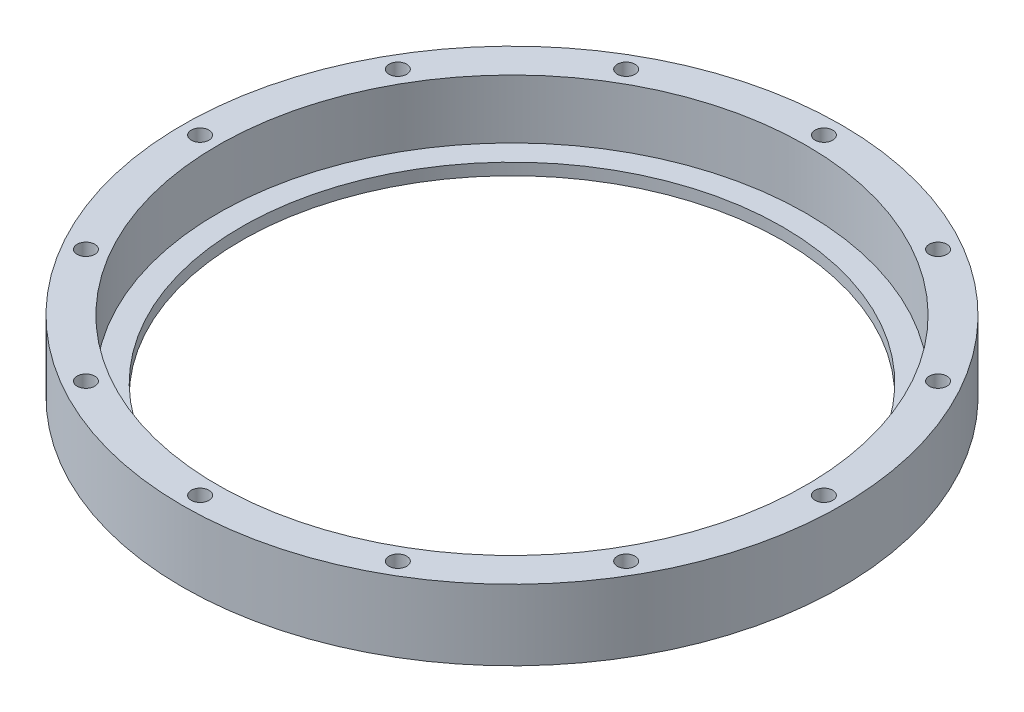
ISO-10303-21;
HEADER;
FILE_DESCRIPTION(('STEP AP214'),'2;1');
FILE_NAME('part.step','',(''),(''),'','','');
FILE_SCHEMA(('AUTOMOTIVE_DESIGN { 1 0 10303 214 1 1 1 1 }'));
ENDSEC;
DATA;
#1=APPLICATION_CONTEXT('core data for automotive mechanical design processes');
#2=APPLICATION_PROTOCOL_DEFINITION('international standard','automotive_design',2000,#1);
#3=PRODUCT_CONTEXT('',#1,'mechanical');
#4=PRODUCT('Part','Part','',(#3));
#5=PRODUCT_RELATED_PRODUCT_CATEGORY('part','',(#4));
#6=PRODUCT_DEFINITION_FORMATION('','',#4);
#7=PRODUCT_DEFINITION_CONTEXT('part definition',#1,'design');
#8=PRODUCT_DEFINITION('design','',#6,#7);
#9=PRODUCT_DEFINITION_SHAPE('','',#8);
#10=(LENGTH_UNIT() NAMED_UNIT(*) SI_UNIT(.MILLI.,.METRE.));
#11=(NAMED_UNIT(*) PLANE_ANGLE_UNIT() SI_UNIT($,.RADIAN.));
#12=(NAMED_UNIT(*) SI_UNIT($,.STERADIAN.) SOLID_ANGLE_UNIT());
#13=UNCERTAINTY_MEASURE_WITH_UNIT(LENGTH_MEASURE(1.E-05),#10,'distance_accuracy_value','');
#14=(GEOMETRIC_REPRESENTATION_CONTEXT(3) GLOBAL_UNCERTAINTY_ASSIGNED_CONTEXT((#13)) GLOBAL_UNIT_ASSIGNED_CONTEXT((#10,
#11,#12)) REPRESENTATION_CONTEXT('',''));
#15=CARTESIAN_POINT('',(0.,0.,0.));
#16=DIRECTION('',(0.,0.,1.));
#17=DIRECTION('',(1.,0.,0.));
#18=AXIS2_PLACEMENT_3D('',#15,#16,#17);
#19=CARTESIAN_POINT('',(56.,0.,0.));
#20=DIRECTION('',(0.,-1.,0.));
#21=DIRECTION('',(0.,0.,-1.));
#22=AXIS2_PLACEMENT_3D('',#19,#20,#21);
#23=PLANE('',#22);
#24=CARTESIAN_POINT('',(0.,0.,-53.));
#25=DIRECTION('',(0.,1.,0.));
#26=DIRECTION('',(0.,0.,1.));
#27=AXIS2_PLACEMENT_3D('',#24,#25,#26);
#28=CIRCLE('',#27,1.5);
#29=CARTESIAN_POINT('',(0.,0.,-51.5));
#30=VERTEX_POINT('',#29);
#31=EDGE_CURVE('E89',#30,#30,#28,.T.);
#32=ORIENTED_EDGE('',*,*,#31,.T.);
#33=EDGE_LOOP('',(#32));
#34=FACE_BOUND('',#33,.T.);
#35=CARTESIAN_POINT('',(-26.5,0.,-45.8993464005752));
#36=DIRECTION('',(0.,1.,0.));
#37=DIRECTION('',(0.,0.,1.));
#38=AXIS2_PLACEMENT_3D('',#35,#36,#37);
#39=CIRCLE('',#38,1.5);
#40=CARTESIAN_POINT('',(-26.5,0.,-44.3993464005752));
#41=VERTEX_POINT('',#40);
#42=EDGE_CURVE('E113',#41,#41,#39,.T.);
#43=ORIENTED_EDGE('',*,*,#42,.T.);
#44=EDGE_LOOP('',(#43));
#45=FACE_BOUND('',#44,.T.);
#46=CARTESIAN_POINT('',(-45.8993464005753,0.,-26.5));
#47=DIRECTION('',(0.,1.,0.));
#48=DIRECTION('',(0.,0.,1.));
#49=AXIS2_PLACEMENT_3D('',#46,#47,#48);
#50=CIRCLE('',#49,1.5);
#51=CARTESIAN_POINT('',(-45.8993464005753,0.,-25.));
#52=VERTEX_POINT('',#51);
#53=EDGE_CURVE('E123',#52,#52,#50,.T.);
#54=ORIENTED_EDGE('',*,*,#53,.T.);
#55=EDGE_LOOP('',(#54));
#56=FACE_BOUND('',#55,.T.);
#57=CARTESIAN_POINT('',(-53.,0.,0.));
#58=DIRECTION('',(0.,1.,0.));
#59=DIRECTION('',(0.,0.,1.));
#60=AXIS2_PLACEMENT_3D('',#57,#58,#59);
#61=CIRCLE('',#60,1.5);
#62=CARTESIAN_POINT('',(-53.,0.,1.50000000000001));
#63=VERTEX_POINT('',#62);
#64=EDGE_CURVE('E130',#63,#63,#61,.T.);
#65=ORIENTED_EDGE('',*,*,#64,.T.);
#66=EDGE_LOOP('',(#65));
#67=FACE_BOUND('',#66,.T.);
#68=CARTESIAN_POINT('',(26.5,0.,-45.8993464005752));
#69=DIRECTION('',(0.,1.,0.));
#70=DIRECTION('',(0.,0.,1.));
#71=AXIS2_PLACEMENT_3D('',#68,#69,#70);
#72=CIRCLE('',#71,1.5);
#73=CARTESIAN_POINT('',(26.5,0.,-44.3993464005752));
#74=VERTEX_POINT('',#73);
#75=EDGE_CURVE('E82',#74,#74,#72,.T.);
#76=ORIENTED_EDGE('',*,*,#75,.T.);
#77=EDGE_LOOP('',(#76));
#78=FACE_BOUND('',#77,.T.);
#79=CARTESIAN_POINT('',(45.8993464005752,0.,-26.5));
#80=DIRECTION('',(0.,1.,0.));
#81=DIRECTION('',(0.,0.,1.));
#82=AXIS2_PLACEMENT_3D('',#79,#80,#81);
#83=CIRCLE('',#82,1.5);
#84=CARTESIAN_POINT('',(45.8993464005752,0.,-25.));
#85=VERTEX_POINT('',#84);
#86=EDGE_CURVE('E76',#85,#85,#83,.T.);
#87=ORIENTED_EDGE('',*,*,#86,.T.);
#88=EDGE_LOOP('',(#87));
#89=FACE_BOUND('',#88,.T.);
#90=CARTESIAN_POINT('',(53.,0.,0.));
#91=DIRECTION('',(0.,1.,0.));
#92=DIRECTION('',(0.,0.,1.));
#93=AXIS2_PLACEMENT_3D('',#90,#91,#92);
#94=CIRCLE('',#93,1.5);
#95=CARTESIAN_POINT('',(53.,0.,1.5));
#96=VERTEX_POINT('',#95);
#97=EDGE_CURVE('E75',#96,#96,#94,.T.);
#98=ORIENTED_EDGE('',*,*,#97,.T.);
#99=EDGE_LOOP('',(#98));
#100=FACE_BOUND('',#99,.T.);
#101=CARTESIAN_POINT('',(45.8993464005753,0.,26.5));
#102=DIRECTION('',(0.,1.,0.));
#103=DIRECTION('',(0.,0.,1.));
#104=AXIS2_PLACEMENT_3D('',#101,#102,#103);
#105=CIRCLE('',#104,1.5);
#106=CARTESIAN_POINT('',(45.8993464005753,0.,28.));
#107=VERTEX_POINT('',#106);
#108=EDGE_CURVE('E62',#107,#107,#105,.T.);
#109=ORIENTED_EDGE('',*,*,#108,.T.);
#110=EDGE_LOOP('',(#109));
#111=FACE_BOUND('',#110,.T.);
#112=CARTESIAN_POINT('',(26.5,0.,45.8993464005752));
#113=DIRECTION('',(0.,1.,0.));
#114=DIRECTION('',(0.,0.,1.));
#115=AXIS2_PLACEMENT_3D('',#112,#113,#114);
#116=CIRCLE('',#115,1.5);
#117=CARTESIAN_POINT('',(26.5,0.,47.3993464005752));
#118=VERTEX_POINT('',#117);
#119=EDGE_CURVE('E109',#118,#118,#116,.T.);
#120=ORIENTED_EDGE('',*,*,#119,.T.);
#121=EDGE_LOOP('',(#120));
#122=FACE_BOUND('',#121,.T.);
#123=CARTESIAN_POINT('',(0.,0.,53.));
#124=DIRECTION('',(0.,1.,0.));
#125=DIRECTION('',(0.,0.,1.));
#126=AXIS2_PLACEMENT_3D('',#123,#124,#125);
#127=CIRCLE('',#126,1.5);
#128=CARTESIAN_POINT('',(0.,0.,54.5));
#129=VERTEX_POINT('',#128);
#130=EDGE_CURVE('E102',#129,#129,#127,.T.);
#131=ORIENTED_EDGE('',*,*,#130,.T.);
#132=EDGE_LOOP('',(#131));
#133=FACE_BOUND('',#132,.T.);
#134=CARTESIAN_POINT('',(-26.5,0.,45.8993464005753));
#135=DIRECTION('',(0.,1.,0.));
#136=DIRECTION('',(0.,0.,1.));
#137=AXIS2_PLACEMENT_3D('',#134,#135,#136);
#138=CIRCLE('',#137,1.5);
#139=CARTESIAN_POINT('',(-26.5,0.,47.3993464005753));
#140=VERTEX_POINT('',#139);
#141=EDGE_CURVE('E98',#140,#140,#138,.T.);
#142=ORIENTED_EDGE('',*,*,#141,.T.);
#143=EDGE_LOOP('',(#142));
#144=FACE_BOUND('',#143,.T.);
#145=CARTESIAN_POINT('',(-45.8993464005752,0.,26.5));
#146=DIRECTION('',(0.,1.,0.));
#147=DIRECTION('',(0.,0.,1.));
#148=AXIS2_PLACEMENT_3D('',#145,#146,#147);
#149=CIRCLE('',#148,1.5);
#150=CARTESIAN_POINT('',(-45.8993464005752,0.,28.));
#151=VERTEX_POINT('',#150);
#152=EDGE_CURVE('E93',#151,#151,#149,.T.);
#153=ORIENTED_EDGE('',*,*,#152,.T.);
#154=EDGE_LOOP('',(#153));
#155=FACE_BOUND('',#154,.T.);
#156=CARTESIAN_POINT('',(0.,0.,0.));
#157=DIRECTION('',(0.,-1.,0.));
#158=DIRECTION('',(0.,0.,-1.));
#159=AXIS2_PLACEMENT_3D('',#156,#157,#158);
#160=CIRCLE('',#159,56.);
#161=CARTESIAN_POINT('',(0.,0.,-56.));
#162=VERTEX_POINT('',#161);
#163=EDGE_CURVE('E63',#162,#162,#160,.T.);
#164=ORIENTED_EDGE('',*,*,#163,.T.);
#165=EDGE_LOOP('',(#164));
#166=FACE_BOUND('',#165,.T.);
#167=CARTESIAN_POINT('',(0.,0.,0.));
#168=DIRECTION('',(0.,-1.,0.));
#169=DIRECTION('',(0.,0.,-1.));
#170=AXIS2_PLACEMENT_3D('',#167,#168,#169);
#171=CIRCLE('',#170,46.);
#172=CARTESIAN_POINT('',(0.,0.,-46.));
#173=VERTEX_POINT('',#172);
#174=EDGE_CURVE('E10',#173,#173,#171,.T.);
#175=ORIENTED_EDGE('',*,*,#174,.F.);
#176=EDGE_LOOP('',(#175));
#177=FACE_BOUND('',#176,.T.);
#178=ADVANCED_FACE('F39',(#34,#45,#56,#67,#78,#89,#100,#111,#122,#133,#144,#155,#166,#177),#23,.T.);
#179=CARTESIAN_POINT('',(0.,0.,0.));
#180=DIRECTION('',(0.,-1.,0.));
#181=DIRECTION('',(0.,0.,-1.));
#182=AXIS2_PLACEMENT_3D('',#179,#180,#181);
#183=CYLINDRICAL_SURFACE('',#182,46.);
#184=ORIENTED_EDGE('',*,*,#174,.T.);
#185=EDGE_LOOP('',(#184));
#186=FACE_BOUND('',#185,.T.);
#187=CARTESIAN_POINT('',(0.,2.,0.));
#188=DIRECTION('',(0.,-1.,0.));
#189=DIRECTION('',(0.,0.,-1.));
#190=AXIS2_PLACEMENT_3D('',#187,#188,#189);
#191=CIRCLE('',#190,46.);
#192=CARTESIAN_POINT('',(0.,2.,-46.));
#193=VERTEX_POINT('',#192);
#194=EDGE_CURVE('E44',#193,#193,#191,.T.);
#195=ORIENTED_EDGE('',*,*,#194,.F.);
#196=EDGE_LOOP('',(#195));
#197=FACE_BOUND('',#196,.T.);
#198=ADVANCED_FACE('F179',(#186,#197),#183,.F.);
#199=CARTESIAN_POINT('',(46.,2.,0.));
#200=DIRECTION('',(0.,1.,0.));
#201=DIRECTION('',(0.,0.,1.));
#202=AXIS2_PLACEMENT_3D('',#199,#200,#201);
#203=PLANE('',#202);
#204=ORIENTED_EDGE('',*,*,#194,.T.);
#205=EDGE_LOOP('',(#204));
#206=FACE_BOUND('',#205,.T.);
#207=CARTESIAN_POINT('',(0.,2.,0.));
#208=DIRECTION('',(0.,-1.,0.));
#209=DIRECTION('',(0.,0.,-1.));
#210=AXIS2_PLACEMENT_3D('',#207,#208,#209);
#211=CIRCLE('',#210,50.);
#212=CARTESIAN_POINT('',(0.,2.,-50.));
#213=VERTEX_POINT('',#212);
#214=EDGE_CURVE('E47',#213,#213,#211,.T.);
#215=ORIENTED_EDGE('',*,*,#214,.F.);
#216=EDGE_LOOP('',(#215));
#217=FACE_BOUND('',#216,.T.);
#218=ADVANCED_FACE('F183',(#206,#217),#203,.T.);
#219=CARTESIAN_POINT('',(0.,0.,0.));
#220=DIRECTION('',(0.,-1.,0.));
#221=DIRECTION('',(0.,0.,-1.));
#222=AXIS2_PLACEMENT_3D('',#219,#220,#221);
#223=CYLINDRICAL_SURFACE('',#222,50.);
#224=ORIENTED_EDGE('',*,*,#214,.T.);
#225=EDGE_LOOP('',(#224));
#226=FACE_BOUND('',#225,.T.);
#227=CARTESIAN_POINT('',(0.,12.,0.));
#228=DIRECTION('',(0.,-1.,0.));
#229=DIRECTION('',(0.,0.,-1.));
#230=AXIS2_PLACEMENT_3D('',#227,#228,#229);
#231=CIRCLE('',#230,50.);
#232=CARTESIAN_POINT('',(0.,12.,-50.));
#233=VERTEX_POINT('',#232);
#234=EDGE_CURVE('E52',#233,#233,#231,.T.);
#235=ORIENTED_EDGE('',*,*,#234,.F.);
#236=EDGE_LOOP('',(#235));
#237=FACE_BOUND('',#236,.T.);
#238=ADVANCED_FACE('F145',(#226,#237),#223,.F.);
#239=CARTESIAN_POINT('',(50.,12.,0.));
#240=DIRECTION('',(0.,1.,0.));
#241=DIRECTION('',(0.,0.,1.));
#242=AXIS2_PLACEMENT_3D('',#239,#240,#241);
#243=PLANE('',#242);
#244=CARTESIAN_POINT('',(0.,12.,-53.));
#245=DIRECTION('',(0.,1.,0.));
#246=DIRECTION('',(0.,0.,1.));
#247=AXIS2_PLACEMENT_3D('',#244,#245,#246);
#248=CIRCLE('',#247,1.5);
#249=CARTESIAN_POINT('',(0.,12.,-51.5));
#250=VERTEX_POINT('',#249);
#251=EDGE_CURVE('E64',#250,#250,#248,.T.);
#252=ORIENTED_EDGE('',*,*,#251,.F.);
#253=EDGE_LOOP('',(#252));
#254=FACE_BOUND('',#253,.T.);
#255=CARTESIAN_POINT('',(-26.5,12.,-45.8993464005752));
#256=DIRECTION('',(0.,1.,0.));
#257=DIRECTION('',(0.,0.,1.));
#258=AXIS2_PLACEMENT_3D('',#255,#256,#257);
#259=CIRCLE('',#258,1.5);
#260=CARTESIAN_POINT('',(-26.5,12.,-44.3993464005752));
#261=VERTEX_POINT('',#260);
#262=EDGE_CURVE('E116',#261,#261,#259,.T.);
#263=ORIENTED_EDGE('',*,*,#262,.F.);
#264=EDGE_LOOP('',(#263));
#265=FACE_BOUND('',#264,.T.);
#266=CARTESIAN_POINT('',(-45.8993464005753,12.,-26.5));
#267=DIRECTION('',(0.,1.,0.));
#268=DIRECTION('',(0.,0.,1.));
#269=AXIS2_PLACEMENT_3D('',#266,#267,#268);
#270=CIRCLE('',#269,1.5);
#271=CARTESIAN_POINT('',(-45.8993464005753,12.,-25.));
#272=VERTEX_POINT('',#271);
#273=EDGE_CURVE('E122',#272,#272,#270,.T.);
#274=ORIENTED_EDGE('',*,*,#273,.F.);
#275=EDGE_LOOP('',(#274));
#276=FACE_BOUND('',#275,.T.);
#277=CARTESIAN_POINT('',(-53.,12.,0.));
#278=DIRECTION('',(0.,1.,0.));
#279=DIRECTION('',(0.,0.,1.));
#280=AXIS2_PLACEMENT_3D('',#277,#278,#279);
#281=CIRCLE('',#280,1.5);
#282=CARTESIAN_POINT('',(-53.,12.,1.50000000000001));
#283=VERTEX_POINT('',#282);
#284=EDGE_CURVE('E92',#283,#283,#281,.T.);
#285=ORIENTED_EDGE('',*,*,#284,.F.);
#286=EDGE_LOOP('',(#285));
#287=FACE_BOUND('',#286,.T.);
#288=CARTESIAN_POINT('',(26.5,12.,-45.8993464005752));
#289=DIRECTION('',(0.,1.,0.));
#290=DIRECTION('',(0.,0.,1.));
#291=AXIS2_PLACEMENT_3D('',#288,#289,#290);
#292=CIRCLE('',#291,1.5);
#293=CARTESIAN_POINT('',(26.5,12.,-44.3993464005752));
#294=VERTEX_POINT('',#293);
#295=EDGE_CURVE('E87',#294,#294,#292,.T.);
#296=ORIENTED_EDGE('',*,*,#295,.F.);
#297=EDGE_LOOP('',(#296));
#298=FACE_BOUND('',#297,.T.);
#299=CARTESIAN_POINT('',(45.8993464005752,12.,-26.5));
#300=DIRECTION('',(0.,1.,0.));
#301=DIRECTION('',(0.,0.,1.));
#302=AXIS2_PLACEMENT_3D('',#299,#300,#301);
#303=CIRCLE('',#302,1.5);
#304=CARTESIAN_POINT('',(45.8993464005752,12.,-25.));
#305=VERTEX_POINT('',#304);
#306=EDGE_CURVE('E83',#305,#305,#303,.T.);
#307=ORIENTED_EDGE('',*,*,#306,.F.);
#308=EDGE_LOOP('',(#307));
#309=FACE_BOUND('',#308,.T.);
#310=CARTESIAN_POINT('',(53.,12.,0.));
#311=DIRECTION('',(0.,1.,0.));
#312=DIRECTION('',(0.,0.,1.));
#313=AXIS2_PLACEMENT_3D('',#310,#311,#312);
#314=CIRCLE('',#313,1.5);
#315=CARTESIAN_POINT('',(53.,12.,1.5));
#316=VERTEX_POINT('',#315);
#317=EDGE_CURVE('E73',#316,#316,#314,.T.);
#318=ORIENTED_EDGE('',*,*,#317,.F.);
#319=EDGE_LOOP('',(#318));
#320=FACE_BOUND('',#319,.T.);
#321=CARTESIAN_POINT('',(45.8993464005753,12.,26.5));
#322=DIRECTION('',(0.,1.,0.));
#323=DIRECTION('',(0.,0.,1.));
#324=AXIS2_PLACEMENT_3D('',#321,#322,#323);
#325=CIRCLE('',#324,1.5);
#326=CARTESIAN_POINT('',(45.8993464005753,12.,28.));
#327=VERTEX_POINT('',#326);
#328=EDGE_CURVE('E66',#327,#327,#325,.T.);
#329=ORIENTED_EDGE('',*,*,#328,.F.);
#330=EDGE_LOOP('',(#329));
#331=FACE_BOUND('',#330,.T.);
#332=CARTESIAN_POINT('',(26.5,12.,45.8993464005752));
#333=DIRECTION('',(0.,1.,0.));
#334=DIRECTION('',(0.,0.,1.));
#335=AXIS2_PLACEMENT_3D('',#332,#333,#334);
#336=CIRCLE('',#335,1.5);
#337=CARTESIAN_POINT('',(26.5,12.,47.3993464005752));
#338=VERTEX_POINT('',#337);
#339=EDGE_CURVE('E67',#338,#338,#336,.T.);
#340=ORIENTED_EDGE('',*,*,#339,.F.);
#341=EDGE_LOOP('',(#340));
#342=FACE_BOUND('',#341,.T.);
#343=CARTESIAN_POINT('',(0.,12.,53.));
#344=DIRECTION('',(0.,1.,0.));
#345=DIRECTION('',(0.,0.,1.));
#346=AXIS2_PLACEMENT_3D('',#343,#344,#345);
#347=CIRCLE('',#346,1.5);
#348=CARTESIAN_POINT('',(0.,12.,54.5));
#349=VERTEX_POINT('',#348);
#350=EDGE_CURVE('E110',#349,#349,#347,.T.);
#351=ORIENTED_EDGE('',*,*,#350,.F.);
#352=EDGE_LOOP('',(#351));
#353=FACE_BOUND('',#352,.T.);
#354=CARTESIAN_POINT('',(-26.5,12.,45.8993464005753));
#355=DIRECTION('',(0.,1.,0.));
#356=DIRECTION('',(0.,0.,1.));
#357=AXIS2_PLACEMENT_3D('',#354,#355,#356);
#358=CIRCLE('',#357,1.5);
#359=CARTESIAN_POINT('',(-26.5,12.,47.3993464005753));
#360=VERTEX_POINT('',#359);
#361=EDGE_CURVE('E101',#360,#360,#358,.T.);
#362=ORIENTED_EDGE('',*,*,#361,.F.);
#363=EDGE_LOOP('',(#362));
#364=FACE_BOUND('',#363,.T.);
#365=CARTESIAN_POINT('',(-45.8993464005752,12.,26.5));
#366=DIRECTION('',(0.,1.,0.));
#367=DIRECTION('',(0.,0.,1.));
#368=AXIS2_PLACEMENT_3D('',#365,#366,#367);
#369=CIRCLE('',#368,1.5);
#370=CARTESIAN_POINT('',(-45.8993464005752,12.,28.));
#371=VERTEX_POINT('',#370);
#372=EDGE_CURVE('E94',#371,#371,#369,.T.);
#373=ORIENTED_EDGE('',*,*,#372,.F.);
#374=EDGE_LOOP('',(#373));
#375=FACE_BOUND('',#374,.T.);
#376=ORIENTED_EDGE('',*,*,#234,.T.);
#377=EDGE_LOOP('',(#376));
#378=FACE_BOUND('',#377,.T.);
#379=CARTESIAN_POINT('',(0.,12.,0.));
#380=DIRECTION('',(0.,-1.,0.));
#381=DIRECTION('',(0.,0.,-1.));
#382=AXIS2_PLACEMENT_3D('',#379,#380,#381);
#383=CIRCLE('',#382,56.);
#384=CARTESIAN_POINT('',(0.,12.,-56.));
#385=VERTEX_POINT('',#384);
#386=EDGE_CURVE('E59',#385,#385,#383,.T.);
#387=ORIENTED_EDGE('',*,*,#386,.F.);
#388=EDGE_LOOP('',(#387));
#389=FACE_BOUND('',#388,.T.);
#390=ADVANCED_FACE('F139',(#254,#265,#276,#287,#298,#309,#320,#331,#342,#353,#364,#375,#378,
#389),#243,.T.);
#391=CARTESIAN_POINT('',(0.,0.,0.));
#392=DIRECTION('',(0.,-1.,0.));
#393=DIRECTION('',(0.,0.,-1.));
#394=AXIS2_PLACEMENT_3D('',#391,#392,#393);
#395=CYLINDRICAL_SURFACE('',#394,56.);
#396=ORIENTED_EDGE('',*,*,#386,.T.);
#397=EDGE_LOOP('',(#396));
#398=FACE_BOUND('',#397,.T.);
#399=ORIENTED_EDGE('',*,*,#163,.F.);
#400=EDGE_LOOP('',(#399));
#401=FACE_BOUND('',#400,.T.);
#402=ADVANCED_FACE('F141',(#398,#401),#395,.T.);
#403=CARTESIAN_POINT('',(-45.8993464005752,12.,26.5));
#404=DIRECTION('',(0.,-1.,0.));
#405=DIRECTION('',(0.,0.,-1.));
#406=AXIS2_PLACEMENT_3D('',#403,#404,#405);
#407=CYLINDRICAL_SURFACE('',#406,1.5);
#408=ORIENTED_EDGE('',*,*,#372,.T.);
#409=EDGE_LOOP('',(#408));
#410=FACE_BOUND('',#409,.T.);
#411=ORIENTED_EDGE('',*,*,#152,.F.);
#412=EDGE_LOOP('',(#411));
#413=FACE_BOUND('',#412,.T.);
#414=ADVANCED_FACE('F174',(#410,#413),#407,.F.);
#415=CARTESIAN_POINT('',(-26.5,12.,45.8993464005753));
#416=DIRECTION('',(0.,-1.,0.));
#417=DIRECTION('',(0.,0.,-1.));
#418=AXIS2_PLACEMENT_3D('',#415,#416,#417);
#419=CYLINDRICAL_SURFACE('',#418,1.5);
#420=ORIENTED_EDGE('',*,*,#361,.T.);
#421=EDGE_LOOP('',(#420));
#422=FACE_BOUND('',#421,.T.);
#423=ORIENTED_EDGE('',*,*,#141,.F.);
#424=EDGE_LOOP('',(#423));
#425=FACE_BOUND('',#424,.T.);
#426=ADVANCED_FACE('F211',(#422,#425),#419,.F.);
#427=CARTESIAN_POINT('',(0.,12.,53.));
#428=DIRECTION('',(0.,-1.,0.));
#429=DIRECTION('',(0.,0.,-1.));
#430=AXIS2_PLACEMENT_3D('',#427,#428,#429);
#431=CYLINDRICAL_SURFACE('',#430,1.5);
#432=ORIENTED_EDGE('',*,*,#350,.T.);
#433=EDGE_LOOP('',(#432));
#434=FACE_BOUND('',#433,.T.);
#435=ORIENTED_EDGE('',*,*,#130,.F.);
#436=EDGE_LOOP('',(#435));
#437=FACE_BOUND('',#436,.T.);
#438=ADVANCED_FACE('F220',(#434,#437),#431,.F.);
#439=CARTESIAN_POINT('',(26.5,12.,45.8993464005752));
#440=DIRECTION('',(0.,-1.,0.));
#441=DIRECTION('',(0.,0.,-1.));
#442=AXIS2_PLACEMENT_3D('',#439,#440,#441);
#443=CYLINDRICAL_SURFACE('',#442,1.5);
#444=ORIENTED_EDGE('',*,*,#339,.T.);
#445=EDGE_LOOP('',(#444));
#446=FACE_BOUND('',#445,.T.);
#447=ORIENTED_EDGE('',*,*,#119,.F.);
#448=EDGE_LOOP('',(#447));
#449=FACE_BOUND('',#448,.T.);
#450=ADVANCED_FACE('F240',(#446,#449),#443,.F.);
#451=CARTESIAN_POINT('',(45.8993464005753,12.,26.5));
#452=DIRECTION('',(0.,-1.,0.));
#453=DIRECTION('',(0.,0.,-1.));
#454=AXIS2_PLACEMENT_3D('',#451,#452,#453);
#455=CYLINDRICAL_SURFACE('',#454,1.5);
#456=ORIENTED_EDGE('',*,*,#328,.T.);
#457=EDGE_LOOP('',(#456));
#458=FACE_BOUND('',#457,.T.);
#459=ORIENTED_EDGE('',*,*,#108,.F.);
#460=EDGE_LOOP('',(#459));
#461=FACE_BOUND('',#460,.T.);
#462=ADVANCED_FACE('F232',(#458,#461),#455,.F.);
#463=CARTESIAN_POINT('',(53.,12.,0.));
#464=DIRECTION('',(0.,-1.,0.));
#465=DIRECTION('',(0.,0.,-1.));
#466=AXIS2_PLACEMENT_3D('',#463,#464,#465);
#467=CYLINDRICAL_SURFACE('',#466,1.5);
#468=ORIENTED_EDGE('',*,*,#317,.T.);
#469=EDGE_LOOP('',(#468));
#470=FACE_BOUND('',#469,.T.);
#471=ORIENTED_EDGE('',*,*,#97,.F.);
#472=EDGE_LOOP('',(#471));
#473=FACE_BOUND('',#472,.T.);
#474=ADVANCED_FACE('F227',(#470,#473),#467,.F.);
#475=CARTESIAN_POINT('',(45.8993464005752,12.,-26.5));
#476=DIRECTION('',(0.,-1.,0.));
#477=DIRECTION('',(0.,0.,-1.));
#478=AXIS2_PLACEMENT_3D('',#475,#476,#477);
#479=CYLINDRICAL_SURFACE('',#478,1.5);
#480=ORIENTED_EDGE('',*,*,#306,.T.);
#481=EDGE_LOOP('',(#480));
#482=FACE_BOUND('',#481,.T.);
#483=ORIENTED_EDGE('',*,*,#86,.F.);
#484=EDGE_LOOP('',(#483));
#485=FACE_BOUND('',#484,.T.);
#486=ADVANCED_FACE('F228',(#482,#485),#479,.F.);
#487=CARTESIAN_POINT('',(26.5,12.,-45.8993464005752));
#488=DIRECTION('',(0.,-1.,0.));
#489=DIRECTION('',(0.,0.,-1.));
#490=AXIS2_PLACEMENT_3D('',#487,#488,#489);
#491=CYLINDRICAL_SURFACE('',#490,1.5);
#492=ORIENTED_EDGE('',*,*,#295,.T.);
#493=EDGE_LOOP('',(#492));
#494=FACE_BOUND('',#493,.T.);
#495=ORIENTED_EDGE('',*,*,#75,.F.);
#496=EDGE_LOOP('',(#495));
#497=FACE_BOUND('',#496,.T.);
#498=ADVANCED_FACE('F225',(#494,#497),#491,.F.);
#499=CARTESIAN_POINT('',(-53.,12.,0.));
#500=DIRECTION('',(0.,-1.,0.));
#501=DIRECTION('',(0.,0.,-1.));
#502=AXIS2_PLACEMENT_3D('',#499,#500,#501);
#503=CYLINDRICAL_SURFACE('',#502,1.5);
#504=ORIENTED_EDGE('',*,*,#284,.T.);
#505=EDGE_LOOP('',(#504));
#506=FACE_BOUND('',#505,.T.);
#507=ORIENTED_EDGE('',*,*,#64,.F.);
#508=EDGE_LOOP('',(#507));
#509=FACE_BOUND('',#508,.T.);
#510=ADVANCED_FACE('F223',(#506,#509),#503,.F.);
#511=CARTESIAN_POINT('',(-45.8993464005753,12.,-26.5));
#512=DIRECTION('',(0.,-1.,0.));
#513=DIRECTION('',(0.,0.,-1.));
#514=AXIS2_PLACEMENT_3D('',#511,#512,#513);
#515=CYLINDRICAL_SURFACE('',#514,1.5);
#516=ORIENTED_EDGE('',*,*,#273,.T.);
#517=EDGE_LOOP('',(#516));
#518=FACE_BOUND('',#517,.T.);
#519=ORIENTED_EDGE('',*,*,#53,.F.);
#520=EDGE_LOOP('',(#519));
#521=FACE_BOUND('',#520,.T.);
#522=ADVANCED_FACE('F321',(#518,#521),#515,.F.);
#523=CARTESIAN_POINT('',(-26.5,12.,-45.8993464005752));
#524=DIRECTION('',(0.,-1.,0.));
#525=DIRECTION('',(0.,0.,-1.));
#526=AXIS2_PLACEMENT_3D('',#523,#524,#525);
#527=CYLINDRICAL_SURFACE('',#526,1.5);
#528=ORIENTED_EDGE('',*,*,#262,.T.);
#529=EDGE_LOOP('',(#528));
#530=FACE_BOUND('',#529,.T.);
#531=ORIENTED_EDGE('',*,*,#42,.F.);
#532=EDGE_LOOP('',(#531));
#533=FACE_BOUND('',#532,.T.);
#534=ADVANCED_FACE('F332',(#530,#533),#527,.F.);
#535=CARTESIAN_POINT('',(0.,12.,-53.));
#536=DIRECTION('',(0.,-1.,0.));
#537=DIRECTION('',(0.,0.,-1.));
#538=AXIS2_PLACEMENT_3D('',#535,#536,#537);
#539=CYLINDRICAL_SURFACE('',#538,1.5);
#540=ORIENTED_EDGE('',*,*,#251,.T.);
#541=EDGE_LOOP('',(#540));
#542=FACE_BOUND('',#541,.T.);
#543=ORIENTED_EDGE('',*,*,#31,.F.);
#544=EDGE_LOOP('',(#543));
#545=FACE_BOUND('',#544,.T.);
#546=ADVANCED_FACE('F140',(#542,#545),#539,.F.);
#547=CLOSED_SHELL('',(#178,#198,#218,#238,#390,#402,#414,#426,#438,#450,#462,#474,#486,#498,
#510,#522,#534,#546));
#548=MANIFOLD_SOLID_BREP('B2',#547);
#549=ADVANCED_BREP_SHAPE_REPRESENTATION('',(#18,#548),#14);
#550=SHAPE_DEFINITION_REPRESENTATION(#9,#549);
ENDSEC;
END-ISO-10303-21;
